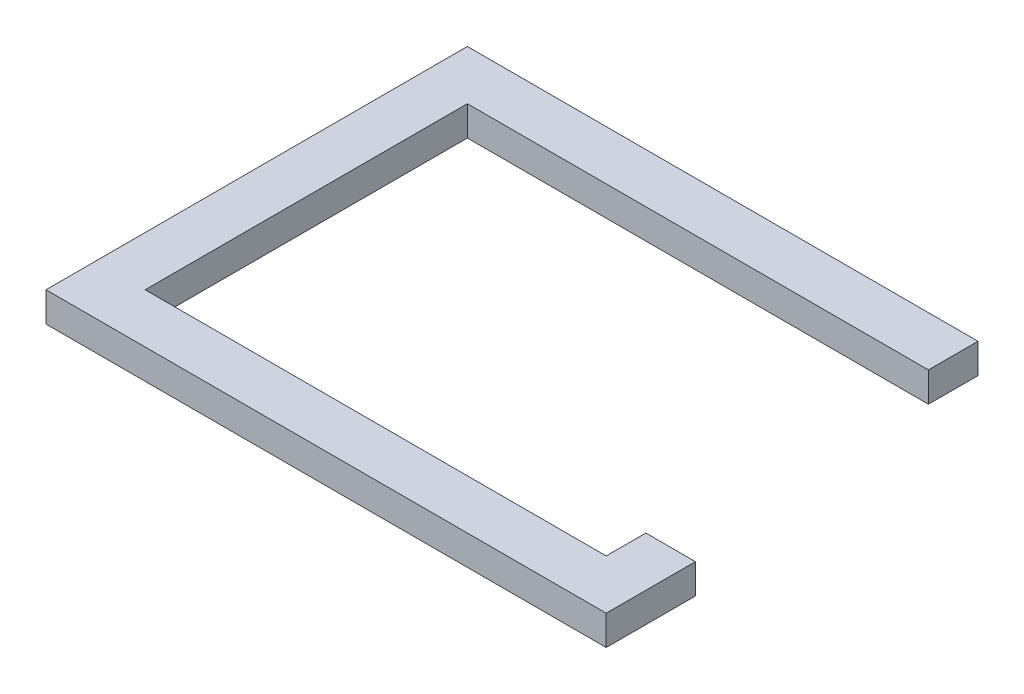
ISO-10303-21;
HEADER;
FILE_DESCRIPTION(('STEP AP214'),'2;1');
FILE_NAME('part.step','',(''),(''),'','','');
FILE_SCHEMA(('AUTOMOTIVE_DESIGN { 1 0 10303 214 1 1 1 1 }'));
ENDSEC;
DATA;
#1=APPLICATION_CONTEXT('core data for automotive mechanical design processes');
#2=APPLICATION_PROTOCOL_DEFINITION('international standard','automotive_design',2000,#1);
#3=PRODUCT_CONTEXT('',#1,'mechanical');
#4=PRODUCT('Part','Part','',(#3));
#5=PRODUCT_RELATED_PRODUCT_CATEGORY('part','',(#4));
#6=PRODUCT_DEFINITION_FORMATION('','',#4);
#7=PRODUCT_DEFINITION_CONTEXT('part definition',#1,'design');
#8=PRODUCT_DEFINITION('design','',#6,#7);
#9=PRODUCT_DEFINITION_SHAPE('','',#8);
#10=(LENGTH_UNIT() NAMED_UNIT(*) SI_UNIT(.MILLI.,.METRE.));
#11=(NAMED_UNIT(*) PLANE_ANGLE_UNIT() SI_UNIT($,.RADIAN.));
#12=(NAMED_UNIT(*) SI_UNIT($,.STERADIAN.) SOLID_ANGLE_UNIT());
#13=UNCERTAINTY_MEASURE_WITH_UNIT(LENGTH_MEASURE(1.E-05),#10,'distance_accuracy_value','');
#14=(GEOMETRIC_REPRESENTATION_CONTEXT(3) GLOBAL_UNCERTAINTY_ASSIGNED_CONTEXT((#13)) GLOBAL_UNIT_ASSIGNED_CONTEXT((#10,
#11,#12)) REPRESENTATION_CONTEXT('',''));
#15=CARTESIAN_POINT('',(0.,0.,0.));
#16=DIRECTION('',(0.,0.,1.));
#17=DIRECTION('',(1.,0.,0.));
#18=AXIS2_PLACEMENT_3D('',#15,#16,#17);
#19=CARTESIAN_POINT('',(0.,3.,42.5));
#20=DIRECTION('',(1.,0.,0.));
#21=DIRECTION('',(0.,0.,-1.));
#22=AXIS2_PLACEMENT_3D('',#19,#20,#21);
#23=PLANE('',#22);
#24=DIRECTION('',(0.,0.,1.));
#25=VECTOR('',#24,1.);
#26=CARTESIAN_POINT('',(0.,0.,42.5));
#27=LINE('',#26,#25);
#28=CARTESIAN_POINT('',(0.,0.,0.));
#29=VERTEX_POINT('',#28);
#30=CARTESIAN_POINT('',(0.,0.,42.5));
#31=VERTEX_POINT('',#30);
#32=EDGE_CURVE('E145',#29,#31,#27,.T.);
#33=ORIENTED_EDGE('',*,*,#32,.T.);
#34=DIRECTION('',(0.,-1.,0.));
#35=VECTOR('',#34,1.);
#36=CARTESIAN_POINT('',(0.,3.,42.5));
#37=LINE('',#36,#35);
#38=CARTESIAN_POINT('',(0.,3.,42.5));
#39=VERTEX_POINT('',#38);
#40=EDGE_CURVE('E11',#39,#31,#37,.T.);
#41=ORIENTED_EDGE('',*,*,#40,.F.);
#42=DIRECTION('',(0.,0.,1.));
#43=VECTOR('',#42,1.);
#44=CARTESIAN_POINT('',(0.,3.,42.5));
#45=LINE('',#44,#43);
#46=CARTESIAN_POINT('',(0.,3.,0.));
#47=VERTEX_POINT('',#46);
#48=EDGE_CURVE('E163',#47,#39,#45,.T.);
#49=ORIENTED_EDGE('',*,*,#48,.F.);
#50=DIRECTION('',(0.,-1.,0.));
#51=VECTOR('',#50,1.);
#52=CARTESIAN_POINT('',(0.,3.,0.));
#53=LINE('',#52,#51);
#54=EDGE_CURVE('E141',#47,#29,#53,.T.);
#55=ORIENTED_EDGE('',*,*,#54,.T.);
#56=EDGE_LOOP('',(#33,#41,#49,#55));
#57=FACE_BOUND('',#56,.T.);
#58=ADVANCED_FACE('F37',(#57),#23,.F.);
#59=CARTESIAN_POINT('',(56.5,3.,42.5));
#60=DIRECTION('',(0.,0.,-1.));
#61=DIRECTION('',(-1.,0.,0.));
#62=AXIS2_PLACEMENT_3D('',#59,#60,#61);
#63=PLANE('',#62);
#64=DIRECTION('',(1.,0.,0.));
#65=VECTOR('',#64,1.);
#66=CARTESIAN_POINT('',(56.5,0.,42.5));
#67=LINE('',#66,#65);
#68=CARTESIAN_POINT('',(56.5,0.,42.5));
#69=VERTEX_POINT('',#68);
#70=EDGE_CURVE('E148',#31,#69,#67,.T.);
#71=ORIENTED_EDGE('',*,*,#70,.T.);
#72=DIRECTION('',(0.,-1.,0.));
#73=VECTOR('',#72,1.);
#74=CARTESIAN_POINT('',(56.5,3.,42.5));
#75=LINE('',#74,#73);
#76=CARTESIAN_POINT('',(56.5,3.,42.5));
#77=VERTEX_POINT('',#76);
#78=EDGE_CURVE('E45',#77,#69,#75,.T.);
#79=ORIENTED_EDGE('',*,*,#78,.F.);
#80=DIRECTION('',(1.,0.,0.));
#81=VECTOR('',#80,1.);
#82=CARTESIAN_POINT('',(56.5,3.,42.5));
#83=LINE('',#82,#81);
#84=EDGE_CURVE('E102',#39,#77,#83,.T.);
#85=ORIENTED_EDGE('',*,*,#84,.F.);
#86=ORIENTED_EDGE('',*,*,#40,.T.);
#87=EDGE_LOOP('',(#71,#79,#85,#86));
#88=FACE_BOUND('',#87,.T.);
#89=ADVANCED_FACE('F212',(#88),#63,.F.);
#90=CARTESIAN_POINT('',(56.5,3.,33.5));
#91=DIRECTION('',(-1.,0.,0.));
#92=DIRECTION('',(0.,0.,1.));
#93=AXIS2_PLACEMENT_3D('',#90,#91,#92);
#94=PLANE('',#93);
#95=DIRECTION('',(0.,0.,-1.));
#96=VECTOR('',#95,1.);
#97=CARTESIAN_POINT('',(56.5,0.,33.5));
#98=LINE('',#97,#96);
#99=CARTESIAN_POINT('',(56.5,0.,33.5));
#100=VERTEX_POINT('',#99);
#101=EDGE_CURVE('E150',#69,#100,#98,.T.);
#102=ORIENTED_EDGE('',*,*,#101,.T.);
#103=DIRECTION('',(0.,-1.,0.));
#104=VECTOR('',#103,1.);
#105=CARTESIAN_POINT('',(56.5,3.,33.5));
#106=LINE('',#105,#104);
#107=CARTESIAN_POINT('',(56.5,3.,33.5));
#108=VERTEX_POINT('',#107);
#109=EDGE_CURVE('E176',#108,#100,#106,.T.);
#110=ORIENTED_EDGE('',*,*,#109,.F.);
#111=DIRECTION('',(0.,0.,-1.));
#112=VECTOR('',#111,1.);
#113=CARTESIAN_POINT('',(56.5,3.,33.5));
#114=LINE('',#113,#112);
#115=EDGE_CURVE('E184',#77,#108,#114,.T.);
#116=ORIENTED_EDGE('',*,*,#115,.F.);
#117=ORIENTED_EDGE('',*,*,#78,.T.);
#118=EDGE_LOOP('',(#102,#110,#116,#117));
#119=FACE_BOUND('',#118,.T.);
#120=ADVANCED_FACE('F182',(#119),#94,.F.);
#121=CARTESIAN_POINT('',(51.5,3.,33.5));
#122=DIRECTION('',(0.,0.,1.));
#123=DIRECTION('',(1.,0.,0.));
#124=AXIS2_PLACEMENT_3D('',#121,#122,#123);
#125=PLANE('',#124);
#126=DIRECTION('',(-1.,0.,0.));
#127=VECTOR('',#126,1.);
#128=CARTESIAN_POINT('',(51.5,0.,33.5));
#129=LINE('',#128,#127);
#130=CARTESIAN_POINT('',(51.5,0.,33.5));
#131=VERTEX_POINT('',#130);
#132=EDGE_CURVE('E152',#100,#131,#129,.T.);
#133=ORIENTED_EDGE('',*,*,#132,.T.);
#134=DIRECTION('',(0.,-1.,0.));
#135=VECTOR('',#134,1.);
#136=CARTESIAN_POINT('',(51.5,3.,33.5));
#137=LINE('',#136,#135);
#138=CARTESIAN_POINT('',(51.5,3.,33.5));
#139=VERTEX_POINT('',#138);
#140=EDGE_CURVE('E173',#139,#131,#137,.T.);
#141=ORIENTED_EDGE('',*,*,#140,.F.);
#142=DIRECTION('',(-1.,0.,0.));
#143=VECTOR('',#142,1.);
#144=CARTESIAN_POINT('',(51.5,3.,33.5));
#145=LINE('',#144,#143);
#146=EDGE_CURVE('E202',#108,#139,#145,.T.);
#147=ORIENTED_EDGE('',*,*,#146,.F.);
#148=ORIENTED_EDGE('',*,*,#109,.T.);
#149=EDGE_LOOP('',(#133,#141,#147,#148));
#150=FACE_BOUND('',#149,.T.);
#151=ADVANCED_FACE('F193',(#150),#125,.F.);
#152=CARTESIAN_POINT('',(51.5,3.,37.5));
#153=DIRECTION('',(1.,0.,0.));
#154=DIRECTION('',(0.,0.,-1.));
#155=AXIS2_PLACEMENT_3D('',#152,#153,#154);
#156=PLANE('',#155);
#157=DIRECTION('',(0.,0.,1.));
#158=VECTOR('',#157,1.);
#159=CARTESIAN_POINT('',(51.5,0.,37.5));
#160=LINE('',#159,#158);
#161=CARTESIAN_POINT('',(51.5,0.,37.5));
#162=VERTEX_POINT('',#161);
#163=EDGE_CURVE('E154',#131,#162,#160,.T.);
#164=ORIENTED_EDGE('',*,*,#163,.T.);
#165=DIRECTION('',(0.,-1.,0.));
#166=VECTOR('',#165,1.);
#167=CARTESIAN_POINT('',(51.5,3.,37.5));
#168=LINE('',#167,#166);
#169=CARTESIAN_POINT('',(51.5,3.,37.5));
#170=VERTEX_POINT('',#169);
#171=EDGE_CURVE('E170',#170,#162,#168,.T.);
#172=ORIENTED_EDGE('',*,*,#171,.F.);
#173=DIRECTION('',(0.,0.,1.));
#174=VECTOR('',#173,1.);
#175=CARTESIAN_POINT('',(51.5,3.,37.5));
#176=LINE('',#175,#174);
#177=EDGE_CURVE('E199',#139,#170,#176,.T.);
#178=ORIENTED_EDGE('',*,*,#177,.F.);
#179=ORIENTED_EDGE('',*,*,#140,.T.);
#180=EDGE_LOOP('',(#164,#172,#178,#179));
#181=FACE_BOUND('',#180,.T.);
#182=ADVANCED_FACE('F197',(#181),#156,.F.);
#183=CARTESIAN_POINT('',(4.99999999999999,3.,37.5));
#184=DIRECTION('',(0.,0.,1.));
#185=DIRECTION('',(1.,0.,0.));
#186=AXIS2_PLACEMENT_3D('',#183,#184,#185);
#187=PLANE('',#186);
#188=DIRECTION('',(-1.,0.,0.));
#189=VECTOR('',#188,1.);
#190=CARTESIAN_POINT('',(4.99999999999999,0.,37.5));
#191=LINE('',#190,#189);
#192=CARTESIAN_POINT('',(4.99999999999999,0.,37.5));
#193=VERTEX_POINT('',#192);
#194=EDGE_CURVE('E156',#162,#193,#191,.T.);
#195=ORIENTED_EDGE('',*,*,#194,.T.);
#196=DIRECTION('',(0.,-1.,0.));
#197=VECTOR('',#196,1.);
#198=CARTESIAN_POINT('',(4.99999999999999,3.,37.5));
#199=LINE('',#198,#197);
#200=CARTESIAN_POINT('',(4.99999999999999,3.,37.5));
#201=VERTEX_POINT('',#200);
#202=EDGE_CURVE('E167',#201,#193,#199,.T.);
#203=ORIENTED_EDGE('',*,*,#202,.F.);
#204=DIRECTION('',(-1.,0.,0.));
#205=VECTOR('',#204,1.);
#206=CARTESIAN_POINT('',(4.99999999999999,3.,37.5));
#207=LINE('',#206,#205);
#208=EDGE_CURVE('E201',#170,#201,#207,.T.);
#209=ORIENTED_EDGE('',*,*,#208,.F.);
#210=ORIENTED_EDGE('',*,*,#171,.T.);
#211=EDGE_LOOP('',(#195,#203,#209,#210));
#212=FACE_BOUND('',#211,.T.);
#213=ADVANCED_FACE('F224',(#212),#187,.F.);
#214=CARTESIAN_POINT('',(4.99999999999999,3.,5.));
#215=DIRECTION('',(-1.,0.,0.));
#216=DIRECTION('',(0.,0.,1.));
#217=AXIS2_PLACEMENT_3D('',#214,#215,#216);
#218=PLANE('',#217);
#219=DIRECTION('',(0.,0.,-1.));
#220=VECTOR('',#219,1.);
#221=CARTESIAN_POINT('',(4.99999999999999,0.,5.));
#222=LINE('',#221,#220);
#223=CARTESIAN_POINT('',(4.99999999999999,0.,5.));
#224=VERTEX_POINT('',#223);
#225=EDGE_CURVE('E158',#193,#224,#222,.T.);
#226=ORIENTED_EDGE('',*,*,#225,.T.);
#227=DIRECTION('',(0.,-1.,0.));
#228=VECTOR('',#227,1.);
#229=CARTESIAN_POINT('',(4.99999999999999,3.,5.));
#230=LINE('',#229,#228);
#231=CARTESIAN_POINT('',(4.99999999999999,3.,5.));
#232=VERTEX_POINT('',#231);
#233=EDGE_CURVE('E136',#232,#224,#230,.T.);
#234=ORIENTED_EDGE('',*,*,#233,.F.);
#235=DIRECTION('',(0.,0.,-1.));
#236=VECTOR('',#235,1.);
#237=CARTESIAN_POINT('',(4.99999999999999,3.,5.));
#238=LINE('',#237,#236);
#239=EDGE_CURVE('E127',#201,#232,#238,.T.);
#240=ORIENTED_EDGE('',*,*,#239,.F.);
#241=ORIENTED_EDGE('',*,*,#202,.T.);
#242=EDGE_LOOP('',(#226,#234,#240,#241));
#243=FACE_BOUND('',#242,.T.);
#244=ADVANCED_FACE('F227',(#243),#218,.F.);
#245=CARTESIAN_POINT('',(51.5,3.,5.));
#246=DIRECTION('',(0.,0.,-1.));
#247=DIRECTION('',(-1.,0.,0.));
#248=AXIS2_PLACEMENT_3D('',#245,#246,#247);
#249=PLANE('',#248);
#250=DIRECTION('',(1.,0.,0.));
#251=VECTOR('',#250,1.);
#252=CARTESIAN_POINT('',(51.5,0.,5.));
#253=LINE('',#252,#251);
#254=CARTESIAN_POINT('',(51.5,0.,5.));
#255=VERTEX_POINT('',#254);
#256=EDGE_CURVE('E135',#224,#255,#253,.T.);
#257=ORIENTED_EDGE('',*,*,#256,.T.);
#258=DIRECTION('',(0.,-1.,0.));
#259=VECTOR('',#258,1.);
#260=CARTESIAN_POINT('',(51.5,3.,5.));
#261=LINE('',#260,#259);
#262=CARTESIAN_POINT('',(51.5,3.,5.));
#263=VERTEX_POINT('',#262);
#264=EDGE_CURVE('E132',#263,#255,#261,.T.);
#265=ORIENTED_EDGE('',*,*,#264,.F.);
#266=DIRECTION('',(1.,0.,0.));
#267=VECTOR('',#266,1.);
#268=CARTESIAN_POINT('',(51.5,3.,5.));
#269=LINE('',#268,#267);
#270=EDGE_CURVE('E121',#232,#263,#269,.T.);
#271=ORIENTED_EDGE('',*,*,#270,.F.);
#272=ORIENTED_EDGE('',*,*,#233,.T.);
#273=EDGE_LOOP('',(#257,#265,#271,#272));
#274=FACE_BOUND('',#273,.T.);
#275=ADVANCED_FACE('F133',(#274),#249,.F.);
#276=CARTESIAN_POINT('',(51.5,3.,0.));
#277=DIRECTION('',(-1.,0.,0.));
#278=DIRECTION('',(0.,0.,1.));
#279=AXIS2_PLACEMENT_3D('',#276,#277,#278);
#280=PLANE('',#279);
#281=DIRECTION('',(0.,0.,-1.));
#282=VECTOR('',#281,1.);
#283=CARTESIAN_POINT('',(51.5,0.,0.));
#284=LINE('',#283,#282);
#285=CARTESIAN_POINT('',(51.5,0.,0.));
#286=VERTEX_POINT('',#285);
#287=EDGE_CURVE('E88',#255,#286,#284,.T.);
#288=ORIENTED_EDGE('',*,*,#287,.T.);
#289=DIRECTION('',(0.,-1.,0.));
#290=VECTOR('',#289,1.);
#291=CARTESIAN_POINT('',(51.5,3.,0.));
#292=LINE('',#291,#290);
#293=CARTESIAN_POINT('',(51.5,3.,0.));
#294=VERTEX_POINT('',#293);
#295=EDGE_CURVE('E137',#294,#286,#292,.T.);
#296=ORIENTED_EDGE('',*,*,#295,.F.);
#297=DIRECTION('',(0.,0.,-1.));
#298=VECTOR('',#297,1.);
#299=CARTESIAN_POINT('',(51.5,3.,0.));
#300=LINE('',#299,#298);
#301=EDGE_CURVE('E125',#263,#294,#300,.T.);
#302=ORIENTED_EDGE('',*,*,#301,.F.);
#303=ORIENTED_EDGE('',*,*,#264,.T.);
#304=EDGE_LOOP('',(#288,#296,#302,#303));
#305=FACE_BOUND('',#304,.T.);
#306=ADVANCED_FACE('F139',(#305),#280,.F.);
#307=CARTESIAN_POINT('',(0.,3.,0.));
#308=DIRECTION('',(0.,0.,1.));
#309=DIRECTION('',(1.,0.,0.));
#310=AXIS2_PLACEMENT_3D('',#307,#308,#309);
#311=PLANE('',#310);
#312=DIRECTION('',(-1.,0.,0.));
#313=VECTOR('',#312,1.);
#314=CARTESIAN_POINT('',(0.,0.,0.));
#315=LINE('',#314,#313);
#316=EDGE_CURVE('E94',#286,#29,#315,.T.);
#317=ORIENTED_EDGE('',*,*,#316,.T.);
#318=ORIENTED_EDGE('',*,*,#54,.F.);
#319=DIRECTION('',(-1.,0.,0.));
#320=VECTOR('',#319,1.);
#321=CARTESIAN_POINT('',(0.,3.,0.));
#322=LINE('',#321,#320);
#323=EDGE_CURVE('E53',#294,#47,#322,.T.);
#324=ORIENTED_EDGE('',*,*,#323,.F.);
#325=ORIENTED_EDGE('',*,*,#295,.T.);
#326=EDGE_LOOP('',(#317,#318,#324,#325));
#327=FACE_BOUND('',#326,.T.);
#328=ADVANCED_FACE('F236',(#327),#311,.F.);
#329=CARTESIAN_POINT('',(0.,3.,0.));
#330=DIRECTION('',(0.,-1.,0.));
#331=DIRECTION('',(0.,0.,-1.));
#332=AXIS2_PLACEMENT_3D('',#329,#330,#331);
#333=PLANE('',#332);
#334=ORIENTED_EDGE('',*,*,#48,.T.);
#335=ORIENTED_EDGE('',*,*,#84,.T.);
#336=ORIENTED_EDGE('',*,*,#115,.T.);
#337=ORIENTED_EDGE('',*,*,#146,.T.);
#338=ORIENTED_EDGE('',*,*,#177,.T.);
#339=ORIENTED_EDGE('',*,*,#208,.T.);
#340=ORIENTED_EDGE('',*,*,#239,.T.);
#341=ORIENTED_EDGE('',*,*,#270,.T.);
#342=ORIENTED_EDGE('',*,*,#301,.T.);
#343=ORIENTED_EDGE('',*,*,#323,.T.);
#344=EDGE_LOOP('',(#334,#335,#336,#337,#338,#339,#340,#341,#342,#343));
#345=FACE_BOUND('',#344,.T.);
#346=ADVANCED_FACE('F123',(#345),#333,.F.);
#347=CARTESIAN_POINT('',(0.,0.,0.));
#348=DIRECTION('',(0.,-1.,0.));
#349=DIRECTION('',(0.,0.,-1.));
#350=AXIS2_PLACEMENT_3D('',#347,#348,#349);
#351=PLANE('',#350);
#352=ORIENTED_EDGE('',*,*,#32,.F.);
#353=ORIENTED_EDGE('',*,*,#316,.F.);
#354=ORIENTED_EDGE('',*,*,#287,.F.);
#355=ORIENTED_EDGE('',*,*,#256,.F.);
#356=ORIENTED_EDGE('',*,*,#225,.F.);
#357=ORIENTED_EDGE('',*,*,#194,.F.);
#358=ORIENTED_EDGE('',*,*,#163,.F.);
#359=ORIENTED_EDGE('',*,*,#132,.F.);
#360=ORIENTED_EDGE('',*,*,#101,.F.);
#361=ORIENTED_EDGE('',*,*,#70,.F.);
#362=EDGE_LOOP('',(#352,#353,#354,#355,#356,#357,#358,#359,#360,#361));
#363=FACE_BOUND('',#362,.T.);
#364=ADVANCED_FACE('F188',(#363),#351,.T.);
#365=CLOSED_SHELL('',(#58,#89,#120,#151,#182,#213,#244,#275,#306,#328,#346,#364));
#366=MANIFOLD_SOLID_BREP('B2',#365);
#367=ADVANCED_BREP_SHAPE_REPRESENTATION('',(#18,#366),#14);
#368=SHAPE_DEFINITION_REPRESENTATION(#9,#367);
ENDSEC;
END-ISO-10303-21;
